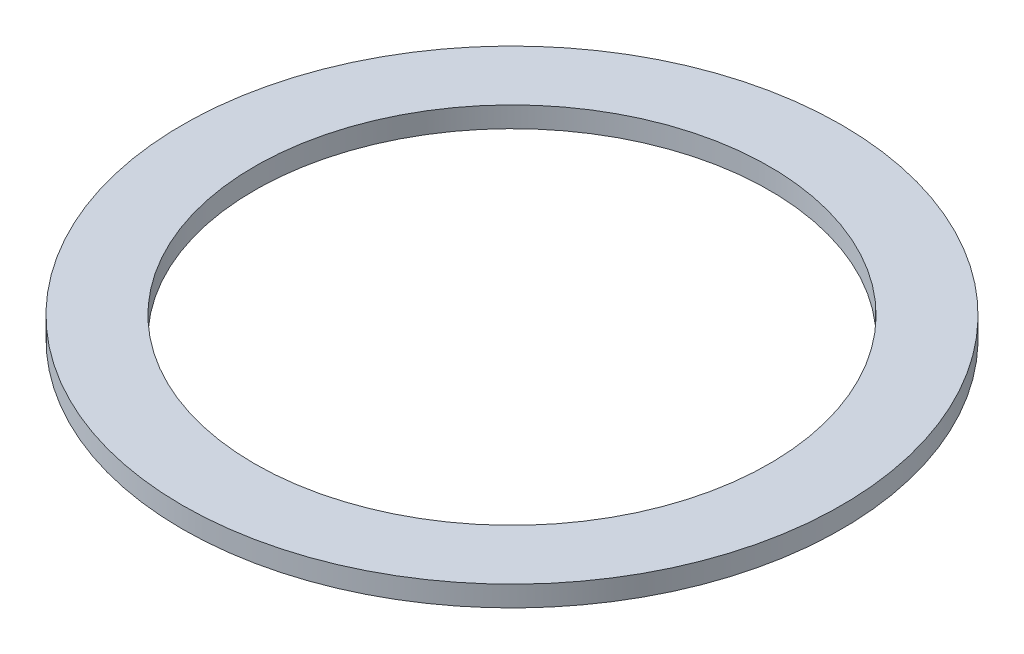
ISO-10303-21;
HEADER;
FILE_DESCRIPTION(('STEP AP214'),'2;1');
FILE_NAME('part.step','',(''),(''),'','','');
FILE_SCHEMA(('AUTOMOTIVE_DESIGN { 1 0 10303 214 1 1 1 1 }'));
ENDSEC;
DATA;
#1=APPLICATION_CONTEXT('core data for automotive mechanical design processes');
#2=APPLICATION_PROTOCOL_DEFINITION('international standard','automotive_design',2000,#1);
#3=PRODUCT_CONTEXT('',#1,'mechanical');
#4=PRODUCT('Part','Part','',(#3));
#5=PRODUCT_RELATED_PRODUCT_CATEGORY('part','',(#4));
#6=PRODUCT_DEFINITION_FORMATION('','',#4);
#7=PRODUCT_DEFINITION_CONTEXT('part definition',#1,'design');
#8=PRODUCT_DEFINITION('design','',#6,#7);
#9=PRODUCT_DEFINITION_SHAPE('','',#8);
#10=(LENGTH_UNIT() NAMED_UNIT(*) SI_UNIT(.MILLI.,.METRE.));
#11=(NAMED_UNIT(*) PLANE_ANGLE_UNIT() SI_UNIT($,.RADIAN.));
#12=(NAMED_UNIT(*) SI_UNIT($,.STERADIAN.) SOLID_ANGLE_UNIT());
#13=UNCERTAINTY_MEASURE_WITH_UNIT(LENGTH_MEASURE(1.E-05),#10,'distance_accuracy_value','');
#14=(GEOMETRIC_REPRESENTATION_CONTEXT(3) GLOBAL_UNCERTAINTY_ASSIGNED_CONTEXT((#13)) GLOBAL_UNIT_ASSIGNED_CONTEXT((#10,
#11,#12)) REPRESENTATION_CONTEXT('',''));
#15=CARTESIAN_POINT('',(0.,0.,0.));
#16=DIRECTION('',(0.,0.,1.));
#17=DIRECTION('',(1.,0.,0.));
#18=AXIS2_PLACEMENT_3D('',#15,#16,#17);
#19=CARTESIAN_POINT('',(0.,1.,0.));
#20=DIRECTION('',(0.,1.,0.));
#21=DIRECTION('',(0.,0.,1.));
#22=AXIS2_PLACEMENT_3D('',#19,#20,#21);
#23=PLANE('',#22);
#24=CARTESIAN_POINT('',(0.,1.,0.));
#25=DIRECTION('',(0.,1.,0.));
#26=DIRECTION('',(0.,0.,1.));
#27=AXIS2_PLACEMENT_3D('',#24,#25,#26);
#28=CIRCLE('',#27,16.);
#29=CARTESIAN_POINT('',(0.,1.,16.));
#30=VERTEX_POINT('',#29);
#31=EDGE_CURVE('E10',#30,#30,#28,.T.);
#32=ORIENTED_EDGE('',*,*,#31,.T.);
#33=EDGE_LOOP('',(#32));
#34=FACE_BOUND('',#33,.T.);
#35=CARTESIAN_POINT('',(0.,1.,0.));
#36=DIRECTION('',(0.,1.,0.));
#37=DIRECTION('',(0.,0.,1.));
#38=AXIS2_PLACEMENT_3D('',#35,#36,#37);
#39=CIRCLE('',#38,12.5);
#40=CARTESIAN_POINT('',(0.,1.,12.5));
#41=VERTEX_POINT('',#40);
#42=EDGE_CURVE('E42',#41,#41,#39,.T.);
#43=ORIENTED_EDGE('',*,*,#42,.F.);
#44=EDGE_LOOP('',(#43));
#45=FACE_BOUND('',#44,.T.);
#46=ADVANCED_FACE('F31',(#34,#45),#23,.T.);
#47=CARTESIAN_POINT('',(0.,0.,0.));
#48=DIRECTION('',(0.,1.,0.));
#49=DIRECTION('',(0.,0.,1.));
#50=AXIS2_PLACEMENT_3D('',#47,#48,#49);
#51=PLANE('',#50);
#52=CARTESIAN_POINT('',(0.,0.,0.));
#53=DIRECTION('',(0.,1.,0.));
#54=DIRECTION('',(0.,0.,1.));
#55=AXIS2_PLACEMENT_3D('',#52,#53,#54);
#56=CIRCLE('',#55,16.);
#57=CARTESIAN_POINT('',(0.,0.,16.));
#58=VERTEX_POINT('',#57);
#59=EDGE_CURVE('E35',#58,#58,#56,.T.);
#60=ORIENTED_EDGE('',*,*,#59,.F.);
#61=EDGE_LOOP('',(#60));
#62=FACE_BOUND('',#61,.T.);
#63=CARTESIAN_POINT('',(0.,0.,0.));
#64=DIRECTION('',(0.,1.,0.));
#65=DIRECTION('',(0.,0.,1.));
#66=AXIS2_PLACEMENT_3D('',#63,#64,#65);
#67=CIRCLE('',#66,12.5);
#68=CARTESIAN_POINT('',(0.,0.,12.5));
#69=VERTEX_POINT('',#68);
#70=EDGE_CURVE('E44',#69,#69,#67,.T.);
#71=ORIENTED_EDGE('',*,*,#70,.T.);
#72=EDGE_LOOP('',(#71));
#73=FACE_BOUND('',#72,.T.);
#74=ADVANCED_FACE('F54',(#62,#73),#51,.F.);
#75=CARTESIAN_POINT('',(0.,1.,0.));
#76=DIRECTION('',(0.,-1.,0.));
#77=DIRECTION('',(0.,0.,-1.));
#78=AXIS2_PLACEMENT_3D('',#75,#76,#77);
#79=CYLINDRICAL_SURFACE('',#78,16.);
#80=ORIENTED_EDGE('',*,*,#31,.F.);
#81=EDGE_LOOP('',(#80));
#82=FACE_BOUND('',#81,.T.);
#83=ORIENTED_EDGE('',*,*,#59,.T.);
#84=EDGE_LOOP('',(#83));
#85=FACE_BOUND('',#84,.T.);
#86=ADVANCED_FACE('F33',(#82,#85),#79,.T.);
#87=CARTESIAN_POINT('',(0.,1.,0.));
#88=DIRECTION('',(0.,-1.,0.));
#89=DIRECTION('',(0.,0.,-1.));
#90=AXIS2_PLACEMENT_3D('',#87,#88,#89);
#91=CYLINDRICAL_SURFACE('',#90,12.5);
#92=ORIENTED_EDGE('',*,*,#42,.T.);
#93=EDGE_LOOP('',(#92));
#94=FACE_BOUND('',#93,.T.);
#95=ORIENTED_EDGE('',*,*,#70,.F.);
#96=EDGE_LOOP('',(#95));
#97=FACE_BOUND('',#96,.T.);
#98=ADVANCED_FACE('F50',(#94,#97),#91,.F.);
#99=CLOSED_SHELL('',(#46,#74,#86,#98));
#100=MANIFOLD_SOLID_BREP('B2',#99);
#101=ADVANCED_BREP_SHAPE_REPRESENTATION('',(#18,#100),#14);
#102=SHAPE_DEFINITION_REPRESENTATION(#9,#101);
ENDSEC;
END-ISO-10303-21;
